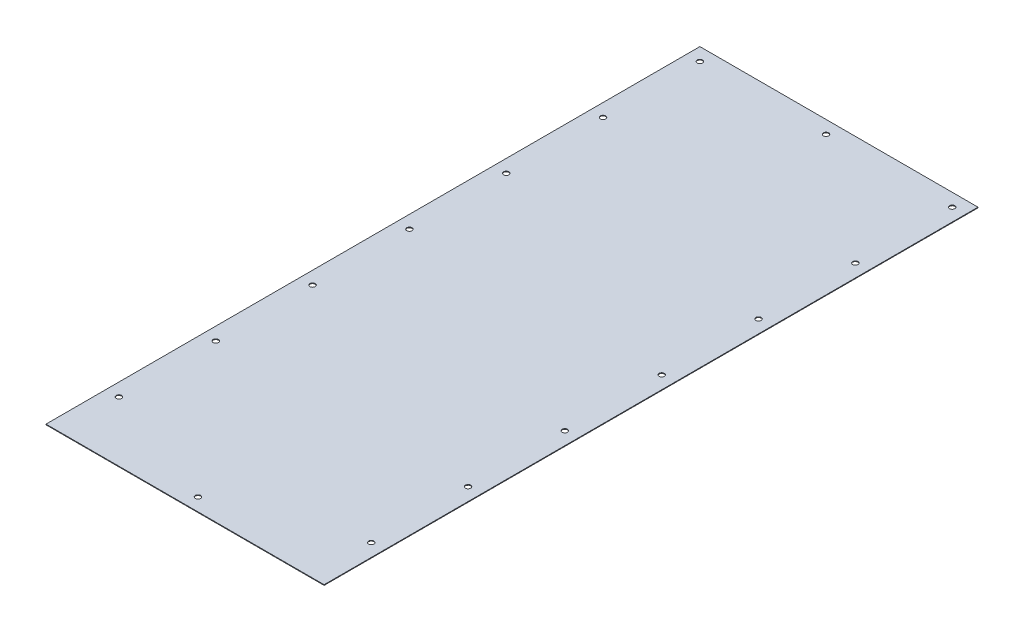
ISO-10303-21;
HEADER;
FILE_DESCRIPTION(('STEP AP214'),'2;1');
FILE_NAME('part.step','',(''),(''),'','','');
FILE_SCHEMA(('AUTOMOTIVE_DESIGN { 1 0 10303 214 1 1 1 1 }'));
ENDSEC;
DATA;
#1=APPLICATION_CONTEXT('core data for automotive mechanical design processes');
#2=APPLICATION_PROTOCOL_DEFINITION('international standard','automotive_design',2000,#1);
#3=PRODUCT_CONTEXT('',#1,'mechanical');
#4=PRODUCT('Part','Part','',(#3));
#5=PRODUCT_RELATED_PRODUCT_CATEGORY('part','',(#4));
#6=PRODUCT_DEFINITION_FORMATION('','',#4);
#7=PRODUCT_DEFINITION_CONTEXT('part definition',#1,'design');
#8=PRODUCT_DEFINITION('design','',#6,#7);
#9=PRODUCT_DEFINITION_SHAPE('','',#8);
#10=(LENGTH_UNIT() NAMED_UNIT(*) SI_UNIT(.MILLI.,.METRE.));
#11=(NAMED_UNIT(*) PLANE_ANGLE_UNIT() SI_UNIT($,.RADIAN.));
#12=(NAMED_UNIT(*) SI_UNIT($,.STERADIAN.) SOLID_ANGLE_UNIT());
#13=UNCERTAINTY_MEASURE_WITH_UNIT(LENGTH_MEASURE(1.E-05),#10,'distance_accuracy_value','');
#14=(GEOMETRIC_REPRESENTATION_CONTEXT(3) GLOBAL_UNCERTAINTY_ASSIGNED_CONTEXT((#13)) GLOBAL_UNIT_ASSIGNED_CONTEXT((#10,
#11,#12)) REPRESENTATION_CONTEXT('',''));
#15=CARTESIAN_POINT('',(0.,0.,0.));
#16=DIRECTION('',(0.,0.,1.));
#17=DIRECTION('',(1.,0.,0.));
#18=AXIS2_PLACEMENT_3D('',#15,#16,#17);
#19=CARTESIAN_POINT('',(0.,1.,0.));
#20=DIRECTION('',(0.,1.,0.));
#21=DIRECTION('',(0.,0.,1.));
#22=AXIS2_PLACEMENT_3D('',#19,#20,#21);
#23=PLANE('',#22);
#24=CARTESIAN_POINT('',(195.425000000035,1.,413.5));
#25=DIRECTION('',(0.,1.,0.));
#26=DIRECTION('',(0.,0.,1.));
#27=AXIS2_PLACEMENT_3D('',#24,#25,#26);
#28=CIRCLE('',#27,4.09999999997554);
#29=CARTESIAN_POINT('',(195.425000000035,1.,417.599999999975));
#30=VERTEX_POINT('',#29);
#31=EDGE_CURVE('E193',#30,#30,#28,.T.);
#32=ORIENTED_EDGE('',*,*,#31,.F.);
#33=EDGE_LOOP('',(#32));
#34=FACE_BOUND('',#33,.T.);
#35=CARTESIAN_POINT('',(195.425000000029,1.,263.5));
#36=DIRECTION('',(0.,1.,0.));
#37=DIRECTION('',(0.,0.,1.));
#38=AXIS2_PLACEMENT_3D('',#35,#36,#37);
#39=CIRCLE('',#38,4.0999999999796);
#40=CARTESIAN_POINT('',(195.425000000029,1.,267.599999999979));
#41=VERTEX_POINT('',#40);
#42=EDGE_CURVE('E181',#41,#41,#39,.T.);
#43=ORIENTED_EDGE('',*,*,#42,.F.);
#44=EDGE_LOOP('',(#43));
#45=FACE_BOUND('',#44,.T.);
#46=CARTESIAN_POINT('',(195.425000000023,1.,113.5));
#47=DIRECTION('',(0.,1.,0.));
#48=DIRECTION('',(0.,0.,1.));
#49=AXIS2_PLACEMENT_3D('',#46,#47,#48);
#50=CIRCLE('',#49,4.09999999998366);
#51=CARTESIAN_POINT('',(195.425000000023,1.,117.599999999983));
#52=VERTEX_POINT('',#51);
#53=EDGE_CURVE('E169',#52,#52,#50,.T.);
#54=ORIENTED_EDGE('',*,*,#53,.F.);
#55=EDGE_LOOP('',(#54));
#56=FACE_BOUND('',#55,.T.);
#57=CARTESIAN_POINT('',(195.425000000017,1.,-36.5000000000002));
#58=DIRECTION('',(0.,1.,0.));
#59=DIRECTION('',(0.,0.,1.));
#60=AXIS2_PLACEMENT_3D('',#57,#58,#59);
#61=CIRCLE('',#60,4.09999999998775);
#62=CARTESIAN_POINT('',(195.425000000017,1.,-32.4000000000124));
#63=VERTEX_POINT('',#62);
#64=EDGE_CURVE('E157',#63,#63,#61,.T.);
#65=ORIENTED_EDGE('',*,*,#64,.F.);
#66=EDGE_LOOP('',(#65));
#67=FACE_BOUND('',#66,.T.);
#68=CARTESIAN_POINT('',(195.425000000003,1.,-186.5));
#69=DIRECTION('',(0.,1.,0.));
#70=DIRECTION('',(0.,0.,1.));
#71=AXIS2_PLACEMENT_3D('',#68,#69,#70);
#72=CIRCLE('',#71,4.10000000000001);
#73=CARTESIAN_POINT('',(195.425000000003,1.,-182.4));
#74=VERTEX_POINT('',#73);
#75=EDGE_CURVE('E145',#74,#74,#72,.T.);
#76=ORIENTED_EDGE('',*,*,#75,.F.);
#77=EDGE_LOOP('',(#76));
#78=FACE_BOUND('',#77,.T.);
#79=CARTESIAN_POINT('',(195.425000000002,1.,-336.5));
#80=DIRECTION('',(0.,1.,0.));
#81=DIRECTION('',(0.,0.,1.));
#82=AXIS2_PLACEMENT_3D('',#79,#80,#81);
#83=CIRCLE('',#82,4.09999999999998);
#84=CARTESIAN_POINT('',(195.425000000002,1.,-332.4));
#85=VERTEX_POINT('',#84);
#86=EDGE_CURVE('E133',#85,#85,#83,.T.);
#87=ORIENTED_EDGE('',*,*,#86,.F.);
#88=EDGE_LOOP('',(#87));
#89=FACE_BOUND('',#88,.T.);
#90=CARTESIAN_POINT('',(0.,1.,486.499999999999));
#91=DIRECTION('',(0.,1.,0.));
#92=DIRECTION('',(0.,0.,1.));
#93=AXIS2_PLACEMENT_3D('',#90,#91,#92);
#94=CIRCLE('',#93,4.10000000000001);
#95=CARTESIAN_POINT('',(0.,1.,490.599999999999));
#96=VERTEX_POINT('',#95);
#97=EDGE_CURVE('E121',#96,#96,#94,.T.);
#98=ORIENTED_EDGE('',*,*,#97,.F.);
#99=EDGE_LOOP('',(#98));
#100=FACE_BOUND('',#99,.T.);
#101=CARTESIAN_POINT('',(-195.425,1.,-486.5));
#102=DIRECTION('',(0.,1.,0.));
#103=DIRECTION('',(0.,0.,1.));
#104=AXIS2_PLACEMENT_3D('',#101,#102,#103);
#105=CIRCLE('',#104,4.09999999999998);
#106=CARTESIAN_POINT('',(-195.425,1.,-482.4));
#107=VERTEX_POINT('',#106);
#108=EDGE_CURVE('E100',#107,#107,#105,.T.);
#109=ORIENTED_EDGE('',*,*,#108,.F.);
#110=EDGE_LOOP('',(#109));
#111=FACE_BOUND('',#110,.T.);
#112=DIRECTION('',(0.,0.,-1.));
#113=VECTOR('',#112,1.);
#114=CARTESIAN_POINT('',(215.425,1.,-506.5));
#115=LINE('',#114,#113);
#116=CARTESIAN_POINT('',(215.425,1.,506.5));
#117=VERTEX_POINT('',#116);
#118=CARTESIAN_POINT('',(215.425,1.,-506.5));
#119=VERTEX_POINT('',#118);
#120=EDGE_CURVE('E85',#117,#119,#115,.T.);
#121=ORIENTED_EDGE('',*,*,#120,.T.);
#122=DIRECTION('',(-1.,0.,0.));
#123=VECTOR('',#122,1.);
#124=CARTESIAN_POINT('',(-215.425,1.,-506.5));
#125=LINE('',#124,#123);
#126=CARTESIAN_POINT('',(-215.425,1.,-506.5));
#127=VERTEX_POINT('',#126);
#128=EDGE_CURVE('E80',#119,#127,#125,.T.);
#129=ORIENTED_EDGE('',*,*,#128,.T.);
#130=DIRECTION('',(0.,0.,1.));
#131=VECTOR('',#130,1.);
#132=CARTESIAN_POINT('',(-215.425,1.,-506.5));
#133=LINE('',#132,#131);
#134=CARTESIAN_POINT('',(-215.425,1.,506.499999999999));
#135=VERTEX_POINT('',#134);
#136=EDGE_CURVE('E83',#127,#135,#133,.T.);
#137=ORIENTED_EDGE('',*,*,#136,.T.);
#138=DIRECTION('',(1.,0.,0.));
#139=VECTOR('',#138,1.);
#140=CARTESIAN_POINT('',(-215.425,1.,506.499999999999));
#141=LINE('',#140,#139);
#142=EDGE_CURVE('E50',#135,#117,#141,.T.);
#143=ORIENTED_EDGE('',*,*,#142,.T.);
#144=EDGE_LOOP('',(#121,#129,#137,#143));
#145=FACE_BOUND('',#144,.T.);
#146=CARTESIAN_POINT('',(195.425,1.,-486.5));
#147=DIRECTION('',(0.,1.,0.));
#148=DIRECTION('',(0.,0.,1.));
#149=AXIS2_PLACEMENT_3D('',#146,#147,#148);
#150=CIRCLE('',#149,4.09999999999998);
#151=CARTESIAN_POINT('',(195.425,1.,-482.4));
#152=VERTEX_POINT('',#151);
#153=EDGE_CURVE('E115',#152,#152,#150,.T.);
#154=ORIENTED_EDGE('',*,*,#153,.F.);
#155=EDGE_LOOP('',(#154));
#156=FACE_BOUND('',#155,.T.);
#157=CARTESIAN_POINT('',(-195.424999999999,1.,-336.5));
#158=DIRECTION('',(0.,1.,0.));
#159=DIRECTION('',(0.,0.,1.));
#160=AXIS2_PLACEMENT_3D('',#157,#158,#159);
#161=CIRCLE('',#160,4.09999999999998);
#162=CARTESIAN_POINT('',(-195.424999999999,1.,-332.4));
#163=VERTEX_POINT('',#162);
#164=EDGE_CURVE('E127',#163,#163,#161,.T.);
#165=ORIENTED_EDGE('',*,*,#164,.F.);
#166=EDGE_LOOP('',(#165));
#167=FACE_BOUND('',#166,.T.);
#168=CARTESIAN_POINT('',(-195.424999999997,1.,-186.5));
#169=DIRECTION('',(0.,1.,0.));
#170=DIRECTION('',(0.,0.,1.));
#171=AXIS2_PLACEMENT_3D('',#168,#169,#170);
#172=CIRCLE('',#171,4.10000000000001);
#173=CARTESIAN_POINT('',(-195.424999999997,1.,-182.4));
#174=VERTEX_POINT('',#173);
#175=EDGE_CURVE('E139',#174,#174,#172,.T.);
#176=ORIENTED_EDGE('',*,*,#175,.F.);
#177=EDGE_LOOP('',(#176));
#178=FACE_BOUND('',#177,.T.);
#179=CARTESIAN_POINT('',(-195.424999999983,1.,-36.5000000000002));
#180=DIRECTION('',(0.,1.,0.));
#181=DIRECTION('',(0.,0.,1.));
#182=AXIS2_PLACEMENT_3D('',#179,#180,#181);
#183=CIRCLE('',#182,4.09999999998775);
#184=CARTESIAN_POINT('',(-195.424999999983,1.,-32.4000000000124));
#185=VERTEX_POINT('',#184);
#186=EDGE_CURVE('E151',#185,#185,#183,.T.);
#187=ORIENTED_EDGE('',*,*,#186,.F.);
#188=EDGE_LOOP('',(#187));
#189=FACE_BOUND('',#188,.T.);
#190=CARTESIAN_POINT('',(-195.424999999977,1.,113.5));
#191=DIRECTION('',(0.,1.,0.));
#192=DIRECTION('',(0.,0.,1.));
#193=AXIS2_PLACEMENT_3D('',#190,#191,#192);
#194=CIRCLE('',#193,4.09999999998366);
#195=CARTESIAN_POINT('',(-195.424999999977,1.,117.599999999983));
#196=VERTEX_POINT('',#195);
#197=EDGE_CURVE('E163',#196,#196,#194,.T.);
#198=ORIENTED_EDGE('',*,*,#197,.F.);
#199=EDGE_LOOP('',(#198));
#200=FACE_BOUND('',#199,.T.);
#201=CARTESIAN_POINT('',(-195.424999999971,1.,263.5));
#202=DIRECTION('',(0.,1.,0.));
#203=DIRECTION('',(0.,0.,1.));
#204=AXIS2_PLACEMENT_3D('',#201,#202,#203);
#205=CIRCLE('',#204,4.0999999999796);
#206=CARTESIAN_POINT('',(-195.424999999971,1.,267.599999999979));
#207=VERTEX_POINT('',#206);
#208=EDGE_CURVE('E175',#207,#207,#205,.T.);
#209=ORIENTED_EDGE('',*,*,#208,.F.);
#210=EDGE_LOOP('',(#209));
#211=FACE_BOUND('',#210,.T.);
#212=CARTESIAN_POINT('',(-195.424999999965,1.,413.5));
#213=DIRECTION('',(0.,1.,0.));
#214=DIRECTION('',(0.,0.,1.));
#215=AXIS2_PLACEMENT_3D('',#212,#213,#214);
#216=CIRCLE('',#215,4.09999999997554);
#217=CARTESIAN_POINT('',(-195.424999999965,1.,417.599999999975));
#218=VERTEX_POINT('',#217);
#219=EDGE_CURVE('E187',#218,#218,#216,.T.);
#220=ORIENTED_EDGE('',*,*,#219,.F.);
#221=EDGE_LOOP('',(#220));
#222=FACE_BOUND('',#221,.T.);
#223=CARTESIAN_POINT('',(0.,1.,-486.5));
#224=DIRECTION('',(0.,1.,0.));
#225=DIRECTION('',(0.,0.,1.));
#226=AXIS2_PLACEMENT_3D('',#223,#224,#225);
#227=CIRCLE('',#226,4.10000000000001);
#228=CARTESIAN_POINT('',(0.,1.,-482.4));
#229=VERTEX_POINT('',#228);
#230=EDGE_CURVE('E199',#229,#229,#227,.T.);
#231=ORIENTED_EDGE('',*,*,#230,.F.);
#232=EDGE_LOOP('',(#231));
#233=FACE_BOUND('',#232,.T.);
#234=ADVANCED_FACE('F33',(#34,#45,#56,#67,#78,#89,#100,#111,#145,#156,#167,#178,#189,#200,#211,
#222,#233),#23,.T.);
#235=CARTESIAN_POINT('',(0.,0.,0.));
#236=DIRECTION('',(0.,1.,0.));
#237=DIRECTION('',(0.,0.,1.));
#238=AXIS2_PLACEMENT_3D('',#235,#236,#237);
#239=PLANE('',#238);
#240=DIRECTION('',(0.,0.,-1.));
#241=VECTOR('',#240,1.);
#242=CARTESIAN_POINT('',(215.425,0.,-506.5));
#243=LINE('',#242,#241);
#244=CARTESIAN_POINT('',(215.425,0.,506.5));
#245=VERTEX_POINT('',#244);
#246=CARTESIAN_POINT('',(215.425,0.,-506.5));
#247=VERTEX_POINT('',#246);
#248=EDGE_CURVE('E97',#245,#247,#243,.T.);
#249=ORIENTED_EDGE('',*,*,#248,.F.);
#250=DIRECTION('',(1.,0.,0.));
#251=VECTOR('',#250,1.);
#252=CARTESIAN_POINT('',(-215.425,0.,506.499999999999));
#253=LINE('',#252,#251);
#254=CARTESIAN_POINT('',(-215.425,0.,506.499999999999));
#255=VERTEX_POINT('',#254);
#256=EDGE_CURVE('E73',#255,#245,#253,.T.);
#257=ORIENTED_EDGE('',*,*,#256,.F.);
#258=DIRECTION('',(0.,0.,1.));
#259=VECTOR('',#258,1.);
#260=CARTESIAN_POINT('',(-215.425,0.,-506.5));
#261=LINE('',#260,#259);
#262=CARTESIAN_POINT('',(-215.425,0.,-506.5));
#263=VERTEX_POINT('',#262);
#264=EDGE_CURVE('E67',#263,#255,#261,.T.);
#265=ORIENTED_EDGE('',*,*,#264,.F.);
#266=DIRECTION('',(-1.,0.,0.));
#267=VECTOR('',#266,1.);
#268=CARTESIAN_POINT('',(-215.425,0.,-506.5));
#269=LINE('',#268,#267);
#270=EDGE_CURVE('E89',#247,#263,#269,.T.);
#271=ORIENTED_EDGE('',*,*,#270,.F.);
#272=EDGE_LOOP('',(#249,#257,#265,#271));
#273=FACE_BOUND('',#272,.T.);
#274=CARTESIAN_POINT('',(-195.425,0.,-486.5));
#275=DIRECTION('',(0.,1.,0.));
#276=DIRECTION('',(0.,0.,1.));
#277=AXIS2_PLACEMENT_3D('',#274,#275,#276);
#278=CIRCLE('',#277,4.09999999999998);
#279=CARTESIAN_POINT('',(-195.425,0.,-482.4));
#280=VERTEX_POINT('',#279);
#281=EDGE_CURVE('E112',#280,#280,#278,.T.);
#282=ORIENTED_EDGE('',*,*,#281,.T.);
#283=EDGE_LOOP('',(#282));
#284=FACE_BOUND('',#283,.T.);
#285=CARTESIAN_POINT('',(195.425,0.,-486.5));
#286=DIRECTION('',(0.,1.,0.));
#287=DIRECTION('',(0.,0.,1.));
#288=AXIS2_PLACEMENT_3D('',#285,#286,#287);
#289=CIRCLE('',#288,4.09999999999998);
#290=CARTESIAN_POINT('',(195.425,0.,-482.4));
#291=VERTEX_POINT('',#290);
#292=EDGE_CURVE('E118',#291,#291,#289,.T.);
#293=ORIENTED_EDGE('',*,*,#292,.T.);
#294=EDGE_LOOP('',(#293));
#295=FACE_BOUND('',#294,.T.);
#296=CARTESIAN_POINT('',(0.,0.,486.499999999999));
#297=DIRECTION('',(0.,1.,0.));
#298=DIRECTION('',(0.,0.,1.));
#299=AXIS2_PLACEMENT_3D('',#296,#297,#298);
#300=CIRCLE('',#299,4.10000000000001);
#301=CARTESIAN_POINT('',(0.,0.,490.599999999999));
#302=VERTEX_POINT('',#301);
#303=EDGE_CURVE('E124',#302,#302,#300,.T.);
#304=ORIENTED_EDGE('',*,*,#303,.T.);
#305=EDGE_LOOP('',(#304));
#306=FACE_BOUND('',#305,.T.);
#307=CARTESIAN_POINT('',(-195.424999999999,0.,-336.5));
#308=DIRECTION('',(0.,1.,0.));
#309=DIRECTION('',(0.,0.,1.));
#310=AXIS2_PLACEMENT_3D('',#307,#308,#309);
#311=CIRCLE('',#310,4.09999999999998);
#312=CARTESIAN_POINT('',(-195.424999999999,0.,-332.4));
#313=VERTEX_POINT('',#312);
#314=EDGE_CURVE('E130',#313,#313,#311,.T.);
#315=ORIENTED_EDGE('',*,*,#314,.T.);
#316=EDGE_LOOP('',(#315));
#317=FACE_BOUND('',#316,.T.);
#318=CARTESIAN_POINT('',(195.425000000002,0.,-336.5));
#319=DIRECTION('',(0.,1.,0.));
#320=DIRECTION('',(0.,0.,1.));
#321=AXIS2_PLACEMENT_3D('',#318,#319,#320);
#322=CIRCLE('',#321,4.09999999999998);
#323=CARTESIAN_POINT('',(195.425000000002,0.,-332.4));
#324=VERTEX_POINT('',#323);
#325=EDGE_CURVE('E136',#324,#324,#322,.T.);
#326=ORIENTED_EDGE('',*,*,#325,.T.);
#327=EDGE_LOOP('',(#326));
#328=FACE_BOUND('',#327,.T.);
#329=CARTESIAN_POINT('',(-195.424999999997,0.,-186.5));
#330=DIRECTION('',(0.,1.,0.));
#331=DIRECTION('',(0.,0.,1.));
#332=AXIS2_PLACEMENT_3D('',#329,#330,#331);
#333=CIRCLE('',#332,4.10000000000001);
#334=CARTESIAN_POINT('',(-195.424999999997,0.,-182.4));
#335=VERTEX_POINT('',#334);
#336=EDGE_CURVE('E142',#335,#335,#333,.T.);
#337=ORIENTED_EDGE('',*,*,#336,.T.);
#338=EDGE_LOOP('',(#337));
#339=FACE_BOUND('',#338,.T.);
#340=CARTESIAN_POINT('',(195.425000000003,0.,-186.5));
#341=DIRECTION('',(0.,1.,0.));
#342=DIRECTION('',(0.,0.,1.));
#343=AXIS2_PLACEMENT_3D('',#340,#341,#342);
#344=CIRCLE('',#343,4.10000000000001);
#345=CARTESIAN_POINT('',(195.425000000003,0.,-182.4));
#346=VERTEX_POINT('',#345);
#347=EDGE_CURVE('E148',#346,#346,#344,.T.);
#348=ORIENTED_EDGE('',*,*,#347,.T.);
#349=EDGE_LOOP('',(#348));
#350=FACE_BOUND('',#349,.T.);
#351=CARTESIAN_POINT('',(-195.424999999983,0.,-36.5000000000002));
#352=DIRECTION('',(0.,1.,0.));
#353=DIRECTION('',(0.,0.,1.));
#354=AXIS2_PLACEMENT_3D('',#351,#352,#353);
#355=CIRCLE('',#354,4.09999999998775);
#356=CARTESIAN_POINT('',(-195.424999999983,0.,-32.4000000000124));
#357=VERTEX_POINT('',#356);
#358=EDGE_CURVE('E154',#357,#357,#355,.T.);
#359=ORIENTED_EDGE('',*,*,#358,.T.);
#360=EDGE_LOOP('',(#359));
#361=FACE_BOUND('',#360,.T.);
#362=CARTESIAN_POINT('',(195.425000000017,0.,-36.5000000000002));
#363=DIRECTION('',(0.,1.,0.));
#364=DIRECTION('',(0.,0.,1.));
#365=AXIS2_PLACEMENT_3D('',#362,#363,#364);
#366=CIRCLE('',#365,4.09999999998775);
#367=CARTESIAN_POINT('',(195.425000000017,0.,-32.4000000000124));
#368=VERTEX_POINT('',#367);
#369=EDGE_CURVE('E160',#368,#368,#366,.T.);
#370=ORIENTED_EDGE('',*,*,#369,.T.);
#371=EDGE_LOOP('',(#370));
#372=FACE_BOUND('',#371,.T.);
#373=CARTESIAN_POINT('',(-195.424999999977,0.,113.5));
#374=DIRECTION('',(0.,1.,0.));
#375=DIRECTION('',(0.,0.,1.));
#376=AXIS2_PLACEMENT_3D('',#373,#374,#375);
#377=CIRCLE('',#376,4.09999999998366);
#378=CARTESIAN_POINT('',(-195.424999999977,0.,117.599999999983));
#379=VERTEX_POINT('',#378);
#380=EDGE_CURVE('E166',#379,#379,#377,.T.);
#381=ORIENTED_EDGE('',*,*,#380,.T.);
#382=EDGE_LOOP('',(#381));
#383=FACE_BOUND('',#382,.T.);
#384=CARTESIAN_POINT('',(195.425000000023,0.,113.5));
#385=DIRECTION('',(0.,1.,0.));
#386=DIRECTION('',(0.,0.,1.));
#387=AXIS2_PLACEMENT_3D('',#384,#385,#386);
#388=CIRCLE('',#387,4.09999999998366);
#389=CARTESIAN_POINT('',(195.425000000023,0.,117.599999999983));
#390=VERTEX_POINT('',#389);
#391=EDGE_CURVE('E172',#390,#390,#388,.T.);
#392=ORIENTED_EDGE('',*,*,#391,.T.);
#393=EDGE_LOOP('',(#392));
#394=FACE_BOUND('',#393,.T.);
#395=CARTESIAN_POINT('',(-195.424999999971,0.,263.5));
#396=DIRECTION('',(0.,1.,0.));
#397=DIRECTION('',(0.,0.,1.));
#398=AXIS2_PLACEMENT_3D('',#395,#396,#397);
#399=CIRCLE('',#398,4.0999999999796);
#400=CARTESIAN_POINT('',(-195.424999999971,0.,267.599999999979));
#401=VERTEX_POINT('',#400);
#402=EDGE_CURVE('E178',#401,#401,#399,.T.);
#403=ORIENTED_EDGE('',*,*,#402,.T.);
#404=EDGE_LOOP('',(#403));
#405=FACE_BOUND('',#404,.T.);
#406=CARTESIAN_POINT('',(195.425000000029,0.,263.5));
#407=DIRECTION('',(0.,1.,0.));
#408=DIRECTION('',(0.,0.,1.));
#409=AXIS2_PLACEMENT_3D('',#406,#407,#408);
#410=CIRCLE('',#409,4.0999999999796);
#411=CARTESIAN_POINT('',(195.425000000029,0.,267.599999999979));
#412=VERTEX_POINT('',#411);
#413=EDGE_CURVE('E184',#412,#412,#410,.T.);
#414=ORIENTED_EDGE('',*,*,#413,.T.);
#415=EDGE_LOOP('',(#414));
#416=FACE_BOUND('',#415,.T.);
#417=CARTESIAN_POINT('',(-195.424999999965,0.,413.5));
#418=DIRECTION('',(0.,1.,0.));
#419=DIRECTION('',(0.,0.,1.));
#420=AXIS2_PLACEMENT_3D('',#417,#418,#419);
#421=CIRCLE('',#420,4.09999999997554);
#422=CARTESIAN_POINT('',(-195.424999999965,0.,417.599999999975));
#423=VERTEX_POINT('',#422);
#424=EDGE_CURVE('E190',#423,#423,#421,.T.);
#425=ORIENTED_EDGE('',*,*,#424,.T.);
#426=EDGE_LOOP('',(#425));
#427=FACE_BOUND('',#426,.T.);
#428=CARTESIAN_POINT('',(195.425000000035,0.,413.5));
#429=DIRECTION('',(0.,1.,0.));
#430=DIRECTION('',(0.,0.,1.));
#431=AXIS2_PLACEMENT_3D('',#428,#429,#430);
#432=CIRCLE('',#431,4.09999999997554);
#433=CARTESIAN_POINT('',(195.425000000035,0.,417.599999999975));
#434=VERTEX_POINT('',#433);
#435=EDGE_CURVE('E196',#434,#434,#432,.T.);
#436=ORIENTED_EDGE('',*,*,#435,.T.);
#437=EDGE_LOOP('',(#436));
#438=FACE_BOUND('',#437,.T.);
#439=CARTESIAN_POINT('',(0.,0.,-486.5));
#440=DIRECTION('',(0.,1.,0.));
#441=DIRECTION('',(0.,0.,1.));
#442=AXIS2_PLACEMENT_3D('',#439,#440,#441);
#443=CIRCLE('',#442,4.10000000000001);
#444=CARTESIAN_POINT('',(0.,0.,-482.4));
#445=VERTEX_POINT('',#444);
#446=EDGE_CURVE('E202',#445,#445,#443,.T.);
#447=ORIENTED_EDGE('',*,*,#446,.T.);
#448=EDGE_LOOP('',(#447));
#449=FACE_BOUND('',#448,.T.);
#450=ADVANCED_FACE('F108',(#273,#284,#295,#306,#317,#328,#339,#350,#361,#372,#383,#394,#405,
#416,#427,#438,#449),#239,.F.);
#451=CARTESIAN_POINT('',(215.425,1.,-506.5));
#452=DIRECTION('',(-1.,0.,0.));
#453=DIRECTION('',(0.,0.,1.));
#454=AXIS2_PLACEMENT_3D('',#451,#452,#453);
#455=PLANE('',#454);
#456=ORIENTED_EDGE('',*,*,#248,.T.);
#457=DIRECTION('',(0.,-1.,0.));
#458=VECTOR('',#457,1.);
#459=CARTESIAN_POINT('',(215.425,1.,-506.5));
#460=LINE('',#459,#458);
#461=EDGE_CURVE('E11',#119,#247,#460,.T.);
#462=ORIENTED_EDGE('',*,*,#461,.F.);
#463=ORIENTED_EDGE('',*,*,#120,.F.);
#464=DIRECTION('',(0.,-1.,0.));
#465=VECTOR('',#464,1.);
#466=CARTESIAN_POINT('',(215.425,1.,506.5));
#467=LINE('',#466,#465);
#468=EDGE_CURVE('E93',#117,#245,#467,.T.);
#469=ORIENTED_EDGE('',*,*,#468,.T.);
#470=EDGE_LOOP('',(#456,#462,#463,#469));
#471=FACE_BOUND('',#470,.T.);
#472=ADVANCED_FACE('F35',(#471),#455,.F.);
#473=CARTESIAN_POINT('',(-215.425,1.,-506.5));
#474=DIRECTION('',(0.,0.,1.));
#475=DIRECTION('',(1.,0.,0.));
#476=AXIS2_PLACEMENT_3D('',#473,#474,#475);
#477=PLANE('',#476);
#478=ORIENTED_EDGE('',*,*,#270,.T.);
#479=DIRECTION('',(0.,-1.,0.));
#480=VECTOR('',#479,1.);
#481=CARTESIAN_POINT('',(-215.425,1.,-506.5));
#482=LINE('',#481,#480);
#483=EDGE_CURVE('E42',#127,#263,#482,.T.);
#484=ORIENTED_EDGE('',*,*,#483,.F.);
#485=ORIENTED_EDGE('',*,*,#128,.F.);
#486=ORIENTED_EDGE('',*,*,#461,.T.);
#487=EDGE_LOOP('',(#478,#484,#485,#486));
#488=FACE_BOUND('',#487,.T.);
#489=ADVANCED_FACE('F88',(#488),#477,.F.);
#490=CARTESIAN_POINT('',(-215.425,1.,-506.5));
#491=DIRECTION('',(1.,0.,0.));
#492=DIRECTION('',(0.,0.,-1.));
#493=AXIS2_PLACEMENT_3D('',#490,#491,#492);
#494=PLANE('',#493);
#495=ORIENTED_EDGE('',*,*,#264,.T.);
#496=DIRECTION('',(0.,-1.,0.));
#497=VECTOR('',#496,1.);
#498=CARTESIAN_POINT('',(-215.425,1.,506.499999999999));
#499=LINE('',#498,#497);
#500=EDGE_CURVE('E90',#135,#255,#499,.T.);
#501=ORIENTED_EDGE('',*,*,#500,.F.);
#502=ORIENTED_EDGE('',*,*,#136,.F.);
#503=ORIENTED_EDGE('',*,*,#483,.T.);
#504=EDGE_LOOP('',(#495,#501,#502,#503));
#505=FACE_BOUND('',#504,.T.);
#506=ADVANCED_FACE('F91',(#505),#494,.F.);
#507=CARTESIAN_POINT('',(-215.425,1.,506.499999999999));
#508=DIRECTION('',(0.,0.,-1.));
#509=DIRECTION('',(-1.,0.,0.));
#510=AXIS2_PLACEMENT_3D('',#507,#508,#509);
#511=PLANE('',#510);
#512=ORIENTED_EDGE('',*,*,#256,.T.);
#513=ORIENTED_EDGE('',*,*,#468,.F.);
#514=ORIENTED_EDGE('',*,*,#142,.F.);
#515=ORIENTED_EDGE('',*,*,#500,.T.);
#516=EDGE_LOOP('',(#512,#513,#514,#515));
#517=FACE_BOUND('',#516,.T.);
#518=ADVANCED_FACE('F105',(#517),#511,.F.);
#519=CARTESIAN_POINT('',(-195.425,1.,-486.5));
#520=DIRECTION('',(0.,-1.,0.));
#521=DIRECTION('',(0.,0.,-1.));
#522=AXIS2_PLACEMENT_3D('',#519,#520,#521);
#523=CYLINDRICAL_SURFACE('',#522,4.09999999999998);
#524=ORIENTED_EDGE('',*,*,#108,.T.);
#525=EDGE_LOOP('',(#524));
#526=FACE_BOUND('',#525,.T.);
#527=ORIENTED_EDGE('',*,*,#281,.F.);
#528=EDGE_LOOP('',(#527));
#529=FACE_BOUND('',#528,.T.);
#530=ADVANCED_FACE('F221',(#526,#529),#523,.F.);
#531=CARTESIAN_POINT('',(195.425,1.,-486.5));
#532=DIRECTION('',(0.,-1.,0.));
#533=DIRECTION('',(0.,0.,-1.));
#534=AXIS2_PLACEMENT_3D('',#531,#532,#533);
#535=CYLINDRICAL_SURFACE('',#534,4.09999999999998);
#536=ORIENTED_EDGE('',*,*,#153,.T.);
#537=EDGE_LOOP('',(#536));
#538=FACE_BOUND('',#537,.T.);
#539=ORIENTED_EDGE('',*,*,#292,.F.);
#540=EDGE_LOOP('',(#539));
#541=FACE_BOUND('',#540,.T.);
#542=ADVANCED_FACE('F267',(#538,#541),#535,.F.);
#543=CARTESIAN_POINT('',(0.,1.,486.499999999999));
#544=DIRECTION('',(0.,-1.,0.));
#545=DIRECTION('',(0.,0.,-1.));
#546=AXIS2_PLACEMENT_3D('',#543,#544,#545);
#547=CYLINDRICAL_SURFACE('',#546,4.10000000000001);
#548=ORIENTED_EDGE('',*,*,#97,.T.);
#549=EDGE_LOOP('',(#548));
#550=FACE_BOUND('',#549,.T.);
#551=ORIENTED_EDGE('',*,*,#303,.F.);
#552=EDGE_LOOP('',(#551));
#553=FACE_BOUND('',#552,.T.);
#554=ADVANCED_FACE('F275',(#550,#553),#547,.F.);
#555=CARTESIAN_POINT('',(-195.424999999999,1.,-336.5));
#556=DIRECTION('',(0.,-1.,0.));
#557=DIRECTION('',(0.,0.,-1.));
#558=AXIS2_PLACEMENT_3D('',#555,#556,#557);
#559=CYLINDRICAL_SURFACE('',#558,4.09999999999998);
#560=ORIENTED_EDGE('',*,*,#164,.T.);
#561=EDGE_LOOP('',(#560));
#562=FACE_BOUND('',#561,.T.);
#563=ORIENTED_EDGE('',*,*,#314,.F.);
#564=EDGE_LOOP('',(#563));
#565=FACE_BOUND('',#564,.T.);
#566=ADVANCED_FACE('F283',(#562,#565),#559,.F.);
#567=CARTESIAN_POINT('',(195.425000000002,1.,-336.5));
#568=DIRECTION('',(0.,-1.,0.));
#569=DIRECTION('',(0.,0.,-1.));
#570=AXIS2_PLACEMENT_3D('',#567,#568,#569);
#571=CYLINDRICAL_SURFACE('',#570,4.09999999999998);
#572=ORIENTED_EDGE('',*,*,#86,.T.);
#573=EDGE_LOOP('',(#572));
#574=FACE_BOUND('',#573,.T.);
#575=ORIENTED_EDGE('',*,*,#325,.F.);
#576=EDGE_LOOP('',(#575));
#577=FACE_BOUND('',#576,.T.);
#578=ADVANCED_FACE('F292',(#574,#577),#571,.F.);
#579=CARTESIAN_POINT('',(-195.424999999997,1.,-186.5));
#580=DIRECTION('',(0.,-1.,0.));
#581=DIRECTION('',(0.,0.,-1.));
#582=AXIS2_PLACEMENT_3D('',#579,#580,#581);
#583=CYLINDRICAL_SURFACE('',#582,4.10000000000001);
#584=ORIENTED_EDGE('',*,*,#175,.T.);
#585=EDGE_LOOP('',(#584));
#586=FACE_BOUND('',#585,.T.);
#587=ORIENTED_EDGE('',*,*,#336,.F.);
#588=EDGE_LOOP('',(#587));
#589=FACE_BOUND('',#588,.T.);
#590=ADVANCED_FACE('F301',(#586,#589),#583,.F.);
#591=CARTESIAN_POINT('',(195.425000000003,1.,-186.5));
#592=DIRECTION('',(0.,-1.,0.));
#593=DIRECTION('',(0.,0.,-1.));
#594=AXIS2_PLACEMENT_3D('',#591,#592,#593);
#595=CYLINDRICAL_SURFACE('',#594,4.10000000000001);
#596=ORIENTED_EDGE('',*,*,#75,.T.);
#597=EDGE_LOOP('',(#596));
#598=FACE_BOUND('',#597,.T.);
#599=ORIENTED_EDGE('',*,*,#347,.F.);
#600=EDGE_LOOP('',(#599));
#601=FACE_BOUND('',#600,.T.);
#602=ADVANCED_FACE('F310',(#598,#601),#595,.F.);
#603=CARTESIAN_POINT('',(-195.424999999983,1.,-36.5000000000002));
#604=DIRECTION('',(0.,-1.,0.));
#605=DIRECTION('',(0.,0.,-1.));
#606=AXIS2_PLACEMENT_3D('',#603,#604,#605);
#607=CYLINDRICAL_SURFACE('',#606,4.09999999998775);
#608=ORIENTED_EDGE('',*,*,#186,.T.);
#609=EDGE_LOOP('',(#608));
#610=FACE_BOUND('',#609,.T.);
#611=ORIENTED_EDGE('',*,*,#358,.F.);
#612=EDGE_LOOP('',(#611));
#613=FACE_BOUND('',#612,.T.);
#614=ADVANCED_FACE('F319',(#610,#613),#607,.F.);
#615=CARTESIAN_POINT('',(195.425000000017,1.,-36.5000000000002));
#616=DIRECTION('',(0.,-1.,0.));
#617=DIRECTION('',(0.,0.,-1.));
#618=AXIS2_PLACEMENT_3D('',#615,#616,#617);
#619=CYLINDRICAL_SURFACE('',#618,4.09999999998775);
#620=ORIENTED_EDGE('',*,*,#64,.T.);
#621=EDGE_LOOP('',(#620));
#622=FACE_BOUND('',#621,.T.);
#623=ORIENTED_EDGE('',*,*,#369,.F.);
#624=EDGE_LOOP('',(#623));
#625=FACE_BOUND('',#624,.T.);
#626=ADVANCED_FACE('F328',(#622,#625),#619,.F.);
#627=CARTESIAN_POINT('',(-195.424999999977,1.,113.5));
#628=DIRECTION('',(0.,-1.,0.));
#629=DIRECTION('',(0.,0.,-1.));
#630=AXIS2_PLACEMENT_3D('',#627,#628,#629);
#631=CYLINDRICAL_SURFACE('',#630,4.09999999998366);
#632=ORIENTED_EDGE('',*,*,#197,.T.);
#633=EDGE_LOOP('',(#632));
#634=FACE_BOUND('',#633,.T.);
#635=ORIENTED_EDGE('',*,*,#380,.F.);
#636=EDGE_LOOP('',(#635));
#637=FACE_BOUND('',#636,.T.);
#638=ADVANCED_FACE('F337',(#634,#637),#631,.F.);
#639=CARTESIAN_POINT('',(195.425000000023,1.,113.5));
#640=DIRECTION('',(0.,-1.,0.));
#641=DIRECTION('',(0.,0.,-1.));
#642=AXIS2_PLACEMENT_3D('',#639,#640,#641);
#643=CYLINDRICAL_SURFACE('',#642,4.09999999998366);
#644=ORIENTED_EDGE('',*,*,#53,.T.);
#645=EDGE_LOOP('',(#644));
#646=FACE_BOUND('',#645,.T.);
#647=ORIENTED_EDGE('',*,*,#391,.F.);
#648=EDGE_LOOP('',(#647));
#649=FACE_BOUND('',#648,.T.);
#650=ADVANCED_FACE('F346',(#646,#649),#643,.F.);
#651=CARTESIAN_POINT('',(-195.424999999971,1.,263.5));
#652=DIRECTION('',(0.,-1.,0.));
#653=DIRECTION('',(0.,0.,-1.));
#654=AXIS2_PLACEMENT_3D('',#651,#652,#653);
#655=CYLINDRICAL_SURFACE('',#654,4.0999999999796);
#656=ORIENTED_EDGE('',*,*,#208,.T.);
#657=EDGE_LOOP('',(#656));
#658=FACE_BOUND('',#657,.T.);
#659=ORIENTED_EDGE('',*,*,#402,.F.);
#660=EDGE_LOOP('',(#659));
#661=FACE_BOUND('',#660,.T.);
#662=ADVANCED_FACE('F355',(#658,#661),#655,.F.);
#663=CARTESIAN_POINT('',(195.425000000029,1.,263.5));
#664=DIRECTION('',(0.,-1.,0.));
#665=DIRECTION('',(0.,0.,-1.));
#666=AXIS2_PLACEMENT_3D('',#663,#664,#665);
#667=CYLINDRICAL_SURFACE('',#666,4.0999999999796);
#668=ORIENTED_EDGE('',*,*,#42,.T.);
#669=EDGE_LOOP('',(#668));
#670=FACE_BOUND('',#669,.T.);
#671=ORIENTED_EDGE('',*,*,#413,.F.);
#672=EDGE_LOOP('',(#671));
#673=FACE_BOUND('',#672,.T.);
#674=ADVANCED_FACE('F364',(#670,#673),#667,.F.);
#675=CARTESIAN_POINT('',(-195.424999999965,1.,413.5));
#676=DIRECTION('',(0.,-1.,0.));
#677=DIRECTION('',(0.,0.,-1.));
#678=AXIS2_PLACEMENT_3D('',#675,#676,#677);
#679=CYLINDRICAL_SURFACE('',#678,4.09999999997554);
#680=ORIENTED_EDGE('',*,*,#219,.T.);
#681=EDGE_LOOP('',(#680));
#682=FACE_BOUND('',#681,.T.);
#683=ORIENTED_EDGE('',*,*,#424,.F.);
#684=EDGE_LOOP('',(#683));
#685=FACE_BOUND('',#684,.T.);
#686=ADVANCED_FACE('F373',(#682,#685),#679,.F.);
#687=CARTESIAN_POINT('',(195.425000000035,1.,413.5));
#688=DIRECTION('',(0.,-1.,0.));
#689=DIRECTION('',(0.,0.,-1.));
#690=AXIS2_PLACEMENT_3D('',#687,#688,#689);
#691=CYLINDRICAL_SURFACE('',#690,4.09999999997554);
#692=ORIENTED_EDGE('',*,*,#31,.T.);
#693=EDGE_LOOP('',(#692));
#694=FACE_BOUND('',#693,.T.);
#695=ORIENTED_EDGE('',*,*,#435,.F.);
#696=EDGE_LOOP('',(#695));
#697=FACE_BOUND('',#696,.T.);
#698=ADVANCED_FACE('F382',(#694,#697),#691,.F.);
#699=CARTESIAN_POINT('',(0.,1.,-486.5));
#700=DIRECTION('',(0.,-1.,0.));
#701=DIRECTION('',(0.,0.,-1.));
#702=AXIS2_PLACEMENT_3D('',#699,#700,#701);
#703=CYLINDRICAL_SURFACE('',#702,4.10000000000001);
#704=ORIENTED_EDGE('',*,*,#230,.T.);
#705=EDGE_LOOP('',(#704));
#706=FACE_BOUND('',#705,.T.);
#707=ORIENTED_EDGE('',*,*,#446,.F.);
#708=EDGE_LOOP('',(#707));
#709=FACE_BOUND('',#708,.T.);
#710=ADVANCED_FACE('F208',(#706,#709),#703,.F.);
#711=CLOSED_SHELL('',(#234,#450,#472,#489,#506,#518,#530,#542,#554,#566,#578,#590,#602,#614,
#626,#638,#650,#662,#674,#686,#698,#710));
#712=MANIFOLD_SOLID_BREP('B2',#711);
#713=ADVANCED_BREP_SHAPE_REPRESENTATION('',(#18,#712),#14);
#714=SHAPE_DEFINITION_REPRESENTATION(#9,#713);
ENDSEC;
END-ISO-10303-21;
